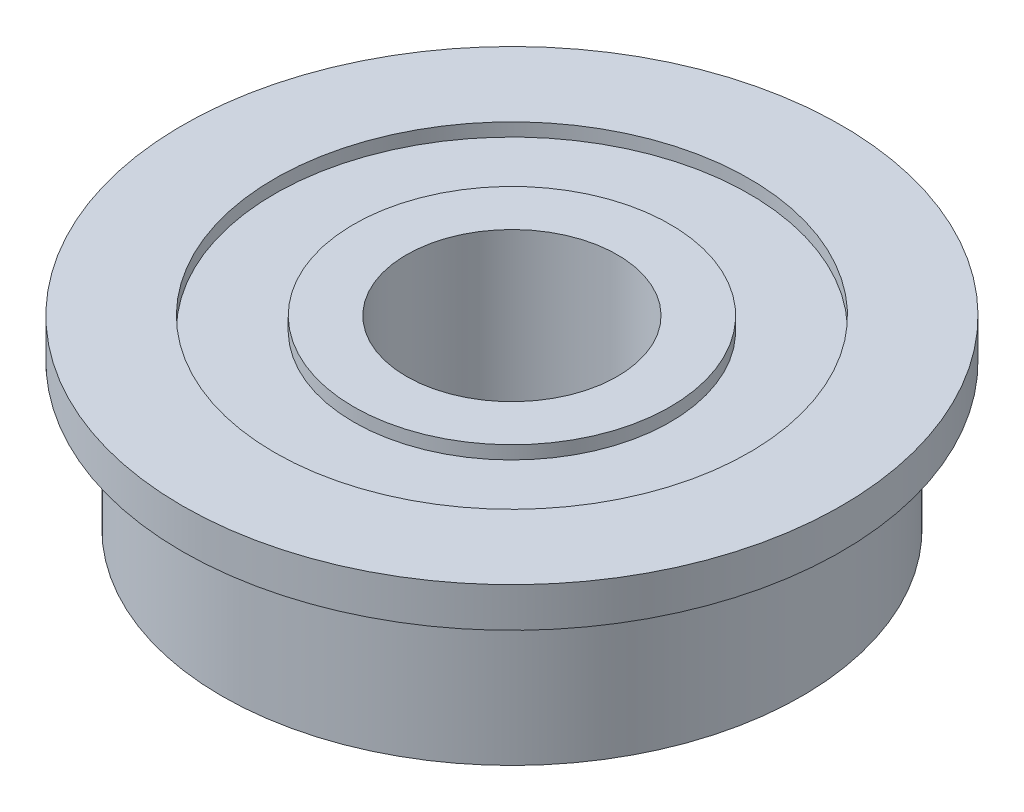
ISO-10303-21;
HEADER;
FILE_DESCRIPTION(('STEP AP214'),'2;1');
FILE_NAME('part.step','',(''),(''),'','','');
FILE_SCHEMA(('AUTOMOTIVE_DESIGN { 1 0 10303 214 1 1 1 1 }'));
ENDSEC;
DATA;
#1=APPLICATION_CONTEXT('core data for automotive mechanical design processes');
#2=APPLICATION_PROTOCOL_DEFINITION('international standard','automotive_design',2000,#1);
#3=PRODUCT_CONTEXT('',#1,'mechanical');
#4=PRODUCT('Part','Part','',(#3));
#5=PRODUCT_RELATED_PRODUCT_CATEGORY('part','',(#4));
#6=PRODUCT_DEFINITION_FORMATION('','',#4);
#7=PRODUCT_DEFINITION_CONTEXT('part definition',#1,'design');
#8=PRODUCT_DEFINITION('design','',#6,#7);
#9=PRODUCT_DEFINITION_SHAPE('','',#8);
#10=(LENGTH_UNIT() NAMED_UNIT(*) SI_UNIT(.MILLI.,.METRE.));
#11=(NAMED_UNIT(*) PLANE_ANGLE_UNIT() SI_UNIT($,.RADIAN.));
#12=(NAMED_UNIT(*) SI_UNIT($,.STERADIAN.) SOLID_ANGLE_UNIT());
#13=UNCERTAINTY_MEASURE_WITH_UNIT(LENGTH_MEASURE(1.E-05),#10,'distance_accuracy_value','');
#14=(GEOMETRIC_REPRESENTATION_CONTEXT(3) GLOBAL_UNCERTAINTY_ASSIGNED_CONTEXT((#13)) GLOBAL_UNIT_ASSIGNED_CONTEXT((#10,
#11,#12)) REPRESENTATION_CONTEXT('',''));
#15=CARTESIAN_POINT('',(0.,0.,0.));
#16=DIRECTION('',(0.,0.,1.));
#17=DIRECTION('',(1.,0.,0.));
#18=AXIS2_PLACEMENT_3D('',#15,#16,#17);
#19=CARTESIAN_POINT('',(0.,0.,0.));
#20=DIRECTION('',(0.,1.,0.));
#21=DIRECTION('',(0.,0.,1.));
#22=AXIS2_PLACEMENT_3D('',#19,#20,#21);
#23=PLANE('',#22);
#24=CARTESIAN_POINT('',(0.,0.,0.));
#25=DIRECTION('',(0.,1.,0.));
#26=DIRECTION('',(0.,0.,1.));
#27=AXIS2_PLACEMENT_3D('',#24,#25,#26);
#28=CIRCLE('',#27,4.);
#29=CARTESIAN_POINT('',(0.,0.,4.));
#30=VERTEX_POINT('',#29);
#31=EDGE_CURVE('E50',#30,#30,#28,.T.);
#32=ORIENTED_EDGE('',*,*,#31,.T.);
#33=EDGE_LOOP('',(#32));
#34=FACE_BOUND('',#33,.T.);
#35=CARTESIAN_POINT('',(0.,0.,0.));
#36=DIRECTION('',(0.,-1.,0.));
#37=DIRECTION('',(0.,0.,-1.));
#38=AXIS2_PLACEMENT_3D('',#35,#36,#37);
#39=CIRCLE('',#38,6.);
#40=CARTESIAN_POINT('',(0.,0.,-6.));
#41=VERTEX_POINT('',#40);
#42=EDGE_CURVE('E92',#41,#41,#39,.T.);
#43=ORIENTED_EDGE('',*,*,#42,.T.);
#44=EDGE_LOOP('',(#43));
#45=FACE_BOUND('',#44,.T.);
#46=ADVANCED_FACE('F37',(#34,#45),#23,.F.);
#47=CARTESIAN_POINT('',(0.,7.,0.));
#48=DIRECTION('',(0.,1.,0.));
#49=DIRECTION('',(0.,0.,1.));
#50=AXIS2_PLACEMENT_3D('',#47,#48,#49);
#51=PLANE('',#50);
#52=CARTESIAN_POINT('',(0.,7.,0.));
#53=DIRECTION('',(0.,1.,0.));
#54=DIRECTION('',(0.,0.,1.));
#55=AXIS2_PLACEMENT_3D('',#52,#53,#54);
#56=CIRCLE('',#55,4.);
#57=CARTESIAN_POINT('',(0.,7.,4.));
#58=VERTEX_POINT('',#57);
#59=EDGE_CURVE('E60',#58,#58,#56,.T.);
#60=ORIENTED_EDGE('',*,*,#59,.F.);
#61=EDGE_LOOP('',(#60));
#62=FACE_BOUND('',#61,.T.);
#63=CARTESIAN_POINT('',(0.,7.,0.));
#64=DIRECTION('',(0.,1.,0.));
#65=DIRECTION('',(0.,0.,1.));
#66=AXIS2_PLACEMENT_3D('',#63,#64,#65);
#67=CIRCLE('',#66,6.);
#68=CARTESIAN_POINT('',(0.,7.,6.));
#69=VERTEX_POINT('',#68);
#70=EDGE_CURVE('E76',#69,#69,#67,.T.);
#71=ORIENTED_EDGE('',*,*,#70,.T.);
#72=EDGE_LOOP('',(#71));
#73=FACE_BOUND('',#72,.T.);
#74=ADVANCED_FACE('F119',(#62,#73),#51,.T.);
#75=CARTESIAN_POINT('',(0.,0.,0.));
#76=DIRECTION('',(0.,-1.,0.));
#77=DIRECTION('',(0.,0.,-1.));
#78=AXIS2_PLACEMENT_3D('',#75,#76,#77);
#79=CIRCLE('',#78,9.);
#80=CARTESIAN_POINT('',(0.,0.,-9.));
#81=VERTEX_POINT('',#80);
#82=EDGE_CURVE('E84',#81,#81,#79,.T.);
#83=ORIENTED_EDGE('',*,*,#82,.F.);
#84=EDGE_LOOP('',(#83));
#85=FACE_BOUND('',#84,.T.);
#86=CARTESIAN_POINT('',(0.,0.,0.));
#87=DIRECTION('',(0.,1.,0.));
#88=DIRECTION('',(0.,0.,1.));
#89=AXIS2_PLACEMENT_3D('',#86,#87,#88);
#90=CIRCLE('',#89,11.);
#91=CARTESIAN_POINT('',(0.,0.,11.));
#92=VERTEX_POINT('',#91);
#93=EDGE_CURVE('E41',#92,#92,#90,.T.);
#94=ORIENTED_EDGE('',*,*,#93,.F.);
#95=EDGE_LOOP('',(#94));
#96=FACE_BOUND('',#95,.T.);
#97=ADVANCED_FACE('F116',(#85,#96),#23,.F.);
#98=CARTESIAN_POINT('',(0.,5.5,0.));
#99=DIRECTION('',(0.,-1.,0.));
#100=DIRECTION('',(0.,0.,-1.));
#101=AXIS2_PLACEMENT_3D('',#98,#99,#100);
#102=CYLINDRICAL_SURFACE('',#101,11.);
#103=CARTESIAN_POINT('',(0.,5.5,0.));
#104=DIRECTION('',(0.,1.,0.));
#105=DIRECTION('',(0.,0.,1.));
#106=AXIS2_PLACEMENT_3D('',#103,#104,#105);
#107=CIRCLE('',#106,11.);
#108=CARTESIAN_POINT('',(0.,5.5,11.));
#109=VERTEX_POINT('',#108);
#110=EDGE_CURVE('E10',#109,#109,#107,.T.);
#111=ORIENTED_EDGE('',*,*,#110,.F.);
#112=EDGE_LOOP('',(#111));
#113=FACE_BOUND('',#112,.T.);
#114=ORIENTED_EDGE('',*,*,#93,.T.);
#115=EDGE_LOOP('',(#114));
#116=FACE_BOUND('',#115,.T.);
#117=ADVANCED_FACE('F39',(#113,#116),#102,.T.);
#118=CARTESIAN_POINT('',(0.,5.5,0.));
#119=DIRECTION('',(0.,-1.,0.));
#120=DIRECTION('',(0.,0.,-1.));
#121=AXIS2_PLACEMENT_3D('',#118,#119,#120);
#122=CYLINDRICAL_SURFACE('',#121,4.);
#123=ORIENTED_EDGE('',*,*,#31,.F.);
#124=EDGE_LOOP('',(#123));
#125=FACE_BOUND('',#124,.T.);
#126=ORIENTED_EDGE('',*,*,#59,.T.);
#127=EDGE_LOOP('',(#126));
#128=FACE_BOUND('',#127,.T.);
#129=ADVANCED_FACE('F123',(#125,#128),#122,.F.);
#130=CARTESIAN_POINT('',(0.,7.,0.));
#131=DIRECTION('',(0.,1.,0.));
#132=DIRECTION('',(0.,0.,1.));
#133=AXIS2_PLACEMENT_3D('',#130,#131,#132);
#134=CIRCLE('',#133,9.);
#135=CARTESIAN_POINT('',(0.,7.,9.));
#136=VERTEX_POINT('',#135);
#137=EDGE_CURVE('E68',#136,#136,#134,.T.);
#138=ORIENTED_EDGE('',*,*,#137,.F.);
#139=EDGE_LOOP('',(#138));
#140=FACE_BOUND('',#139,.T.);
#141=CARTESIAN_POINT('',(0.,7.,0.));
#142=DIRECTION('',(0.,1.,0.));
#143=DIRECTION('',(0.,0.,1.));
#144=AXIS2_PLACEMENT_3D('',#141,#142,#143);
#145=CIRCLE('',#144,12.5);
#146=CARTESIAN_POINT('',(0.,7.,12.5));
#147=VERTEX_POINT('',#146);
#148=EDGE_CURVE('E55',#147,#147,#145,.T.);
#149=ORIENTED_EDGE('',*,*,#148,.T.);
#150=EDGE_LOOP('',(#149));
#151=FACE_BOUND('',#150,.T.);
#152=ADVANCED_FACE('F128',(#140,#151),#51,.T.);
#153=CARTESIAN_POINT('',(0.,5.5,0.));
#154=DIRECTION('',(0.,1.,0.));
#155=DIRECTION('',(0.,0.,1.));
#156=AXIS2_PLACEMENT_3D('',#153,#154,#155);
#157=PLANE('',#156);
#158=ORIENTED_EDGE('',*,*,#110,.T.);
#159=EDGE_LOOP('',(#158));
#160=FACE_BOUND('',#159,.T.);
#161=CARTESIAN_POINT('',(0.,5.5,0.));
#162=DIRECTION('',(0.,1.,0.));
#163=DIRECTION('',(0.,0.,1.));
#164=AXIS2_PLACEMENT_3D('',#161,#162,#163);
#165=CIRCLE('',#164,12.5);
#166=CARTESIAN_POINT('',(0.,5.5,12.5));
#167=VERTEX_POINT('',#166);
#168=EDGE_CURVE('E56',#167,#167,#165,.T.);
#169=ORIENTED_EDGE('',*,*,#168,.F.);
#170=EDGE_LOOP('',(#169));
#171=FACE_BOUND('',#170,.T.);
#172=ADVANCED_FACE('F144',(#160,#171),#157,.F.);
#173=CARTESIAN_POINT('',(0.,7.,0.));
#174=DIRECTION('',(0.,-1.,0.));
#175=DIRECTION('',(0.,0.,-1.));
#176=AXIS2_PLACEMENT_3D('',#173,#174,#175);
#177=CYLINDRICAL_SURFACE('',#176,12.5);
#178=ORIENTED_EDGE('',*,*,#148,.F.);
#179=EDGE_LOOP('',(#178));
#180=FACE_BOUND('',#179,.T.);
#181=ORIENTED_EDGE('',*,*,#168,.T.);
#182=EDGE_LOOP('',(#181));
#183=FACE_BOUND('',#182,.T.);
#184=ADVANCED_FACE('F140',(#180,#183),#177,.T.);
#185=CARTESIAN_POINT('',(0.,6.5,0.));
#186=DIRECTION('',(0.,1.,0.));
#187=DIRECTION('',(0.,0.,1.));
#188=AXIS2_PLACEMENT_3D('',#185,#186,#187);
#189=CYLINDRICAL_SURFACE('',#188,9.);
#190=CARTESIAN_POINT('',(0.,6.5,0.));
#191=DIRECTION('',(0.,1.,0.));
#192=DIRECTION('',(0.,0.,1.));
#193=AXIS2_PLACEMENT_3D('',#190,#191,#192);
#194=CIRCLE('',#193,9.);
#195=CARTESIAN_POINT('',(0.,6.5,9.));
#196=VERTEX_POINT('',#195);
#197=EDGE_CURVE('E67',#196,#196,#194,.T.);
#198=ORIENTED_EDGE('',*,*,#197,.F.);
#199=EDGE_LOOP('',(#198));
#200=FACE_BOUND('',#199,.T.);
#201=ORIENTED_EDGE('',*,*,#137,.T.);
#202=EDGE_LOOP('',(#201));
#203=FACE_BOUND('',#202,.T.);
#204=ADVANCED_FACE('F143',(#200,#203),#189,.F.);
#205=CARTESIAN_POINT('',(0.,6.5,0.));
#206=DIRECTION('',(0.,1.,0.));
#207=DIRECTION('',(0.,0.,1.));
#208=AXIS2_PLACEMENT_3D('',#205,#206,#207);
#209=PLANE('',#208);
#210=CARTESIAN_POINT('',(0.,6.5,0.));
#211=DIRECTION('',(0.,1.,0.));
#212=DIRECTION('',(0.,0.,1.));
#213=AXIS2_PLACEMENT_3D('',#210,#211,#212);
#214=CIRCLE('',#213,6.);
#215=CARTESIAN_POINT('',(0.,6.5,6.));
#216=VERTEX_POINT('',#215);
#217=EDGE_CURVE('E72',#216,#216,#214,.T.);
#218=ORIENTED_EDGE('',*,*,#217,.F.);
#219=EDGE_LOOP('',(#218));
#220=FACE_BOUND('',#219,.T.);
#221=ORIENTED_EDGE('',*,*,#197,.T.);
#222=EDGE_LOOP('',(#221));
#223=FACE_BOUND('',#222,.T.);
#224=ADVANCED_FACE('F152',(#220,#223),#209,.T.);
#225=CARTESIAN_POINT('',(0.,6.5,0.));
#226=DIRECTION('',(0.,1.,0.));
#227=DIRECTION('',(0.,0.,1.));
#228=AXIS2_PLACEMENT_3D('',#225,#226,#227);
#229=CYLINDRICAL_SURFACE('',#228,6.);
#230=ORIENTED_EDGE('',*,*,#217,.T.);
#231=EDGE_LOOP('',(#230));
#232=FACE_BOUND('',#231,.T.);
#233=ORIENTED_EDGE('',*,*,#70,.F.);
#234=EDGE_LOOP('',(#233));
#235=FACE_BOUND('',#234,.T.);
#236=ADVANCED_FACE('F112',(#232,#235),#229,.T.);
#237=CARTESIAN_POINT('',(0.,0.5,0.));
#238=DIRECTION('',(0.,-1.,0.));
#239=DIRECTION('',(0.,0.,-1.));
#240=AXIS2_PLACEMENT_3D('',#237,#238,#239);
#241=CYLINDRICAL_SURFACE('',#240,9.);
#242=CARTESIAN_POINT('',(0.,0.5,0.));
#243=DIRECTION('',(0.,-1.,0.));
#244=DIRECTION('',(0.,0.,-1.));
#245=AXIS2_PLACEMENT_3D('',#242,#243,#244);
#246=CIRCLE('',#245,9.);
#247=CARTESIAN_POINT('',(0.,0.5,-9.));
#248=VERTEX_POINT('',#247);
#249=EDGE_CURVE('E80',#248,#248,#246,.T.);
#250=ORIENTED_EDGE('',*,*,#249,.F.);
#251=EDGE_LOOP('',(#250));
#252=FACE_BOUND('',#251,.T.);
#253=ORIENTED_EDGE('',*,*,#82,.T.);
#254=EDGE_LOOP('',(#253));
#255=FACE_BOUND('',#254,.T.);
#256=ADVANCED_FACE('F106',(#252,#255),#241,.F.);
#257=CARTESIAN_POINT('',(0.,0.5,0.));
#258=DIRECTION('',(0.,-1.,0.));
#259=DIRECTION('',(0.,0.,-1.));
#260=AXIS2_PLACEMENT_3D('',#257,#258,#259);
#261=PLANE('',#260);
#262=CARTESIAN_POINT('',(0.,0.5,0.));
#263=DIRECTION('',(0.,-1.,0.));
#264=DIRECTION('',(0.,0.,-1.));
#265=AXIS2_PLACEMENT_3D('',#262,#263,#264);
#266=CIRCLE('',#265,6.);
#267=CARTESIAN_POINT('',(0.,0.5,-6.));
#268=VERTEX_POINT('',#267);
#269=EDGE_CURVE('E88',#268,#268,#266,.T.);
#270=ORIENTED_EDGE('',*,*,#269,.F.);
#271=EDGE_LOOP('',(#270));
#272=FACE_BOUND('',#271,.T.);
#273=ORIENTED_EDGE('',*,*,#249,.T.);
#274=EDGE_LOOP('',(#273));
#275=FACE_BOUND('',#274,.T.);
#276=ADVANCED_FACE('F103',(#272,#275),#261,.T.);
#277=CARTESIAN_POINT('',(0.,0.5,0.));
#278=DIRECTION('',(0.,-1.,0.));
#279=DIRECTION('',(0.,0.,-1.));
#280=AXIS2_PLACEMENT_3D('',#277,#278,#279);
#281=CYLINDRICAL_SURFACE('',#280,6.);
#282=ORIENTED_EDGE('',*,*,#269,.T.);
#283=EDGE_LOOP('',(#282));
#284=FACE_BOUND('',#283,.T.);
#285=ORIENTED_EDGE('',*,*,#42,.F.);
#286=EDGE_LOOP('',(#285));
#287=FACE_BOUND('',#286,.T.);
#288=ADVANCED_FACE('F100',(#284,#287),#281,.T.);
#289=CLOSED_SHELL('',(#46,#74,#97,#117,#129,#152,#172,#184,#204,#224,#236,#256,#276,#288));
#290=MANIFOLD_SOLID_BREP('B2',#289);
#291=ADVANCED_BREP_SHAPE_REPRESENTATION('',(#18,#290),#14);
#292=SHAPE_DEFINITION_REPRESENTATION(#9,#291);
ENDSEC;
END-ISO-10303-21;
